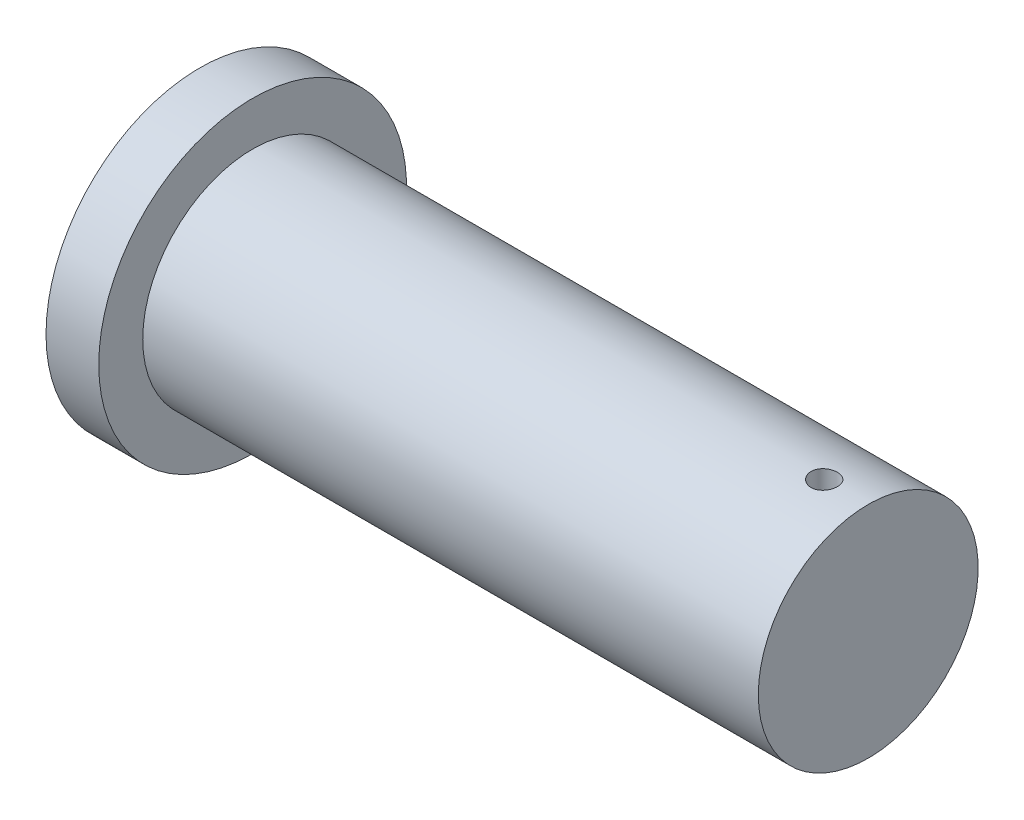
ISO-10303-21;
HEADER;
FILE_DESCRIPTION(('STEP AP214'),'2;1');
FILE_NAME('part.step','',(''),(''),'','','');
FILE_SCHEMA(('AUTOMOTIVE_DESIGN { 1 0 10303 214 1 1 1 1 }'));
ENDSEC;
DATA;
#1=APPLICATION_CONTEXT('core data for automotive mechanical design processes');
#2=APPLICATION_PROTOCOL_DEFINITION('international standard','automotive_design',2000,#1);
#3=PRODUCT_CONTEXT('',#1,'mechanical');
#4=PRODUCT('Part','Part','',(#3));
#5=PRODUCT_RELATED_PRODUCT_CATEGORY('part','',(#4));
#6=PRODUCT_DEFINITION_FORMATION('','',#4);
#7=PRODUCT_DEFINITION_CONTEXT('part definition',#1,'design');
#8=PRODUCT_DEFINITION('design','',#6,#7);
#9=PRODUCT_DEFINITION_SHAPE('','',#8);
#10=(LENGTH_UNIT() NAMED_UNIT(*) SI_UNIT(.MILLI.,.METRE.));
#11=(NAMED_UNIT(*) PLANE_ANGLE_UNIT() SI_UNIT($,.RADIAN.));
#12=(NAMED_UNIT(*) SI_UNIT($,.STERADIAN.) SOLID_ANGLE_UNIT());
#13=UNCERTAINTY_MEASURE_WITH_UNIT(LENGTH_MEASURE(1.E-05),#10,'distance_accuracy_value','');
#14=(GEOMETRIC_REPRESENTATION_CONTEXT(3) GLOBAL_UNCERTAINTY_ASSIGNED_CONTEXT((#13)) GLOBAL_UNIT_ASSIGNED_CONTEXT((#10,
#11,#12)) REPRESENTATION_CONTEXT('',''));
#15=CARTESIAN_POINT('',(0.,0.,0.));
#16=DIRECTION('',(0.,0.,1.));
#17=DIRECTION('',(1.,0.,0.));
#18=AXIS2_PLACEMENT_3D('',#15,#16,#17);
#19=CARTESIAN_POINT('',(0.,0.,0.));
#20=DIRECTION('',(-1.,0.,0.));
#21=DIRECTION('',(0.,0.,1.));
#22=AXIS2_PLACEMENT_3D('',#19,#20,#21);
#23=PLANE('',#22);
#24=CARTESIAN_POINT('',(0.,0.,0.));
#25=DIRECTION('',(-1.,0.,0.));
#26=DIRECTION('',(0.,0.,1.));
#27=AXIS2_PLACEMENT_3D('',#24,#25,#26);
#28=CIRCLE('',#27,250.);
#29=CARTESIAN_POINT('',(0.,0.,250.));
#30=VERTEX_POINT('',#29);
#31=EDGE_CURVE('E10',#30,#30,#28,.T.);
#32=ORIENTED_EDGE('',*,*,#31,.F.);
#33=EDGE_LOOP('',(#32));
#34=FACE_BOUND('',#33,.T.);
#35=ADVANCED_FACE('F33',(#34),#23,.F.);
#36=CARTESIAN_POINT('',(-1520.,0.,0.));
#37=DIRECTION('',(-1.,0.,0.));
#38=DIRECTION('',(0.,0.,1.));
#39=AXIS2_PLACEMENT_3D('',#36,#37,#38);
#40=CYLINDRICAL_SURFACE('',#39,250.);
#41=CARTESIAN_POINT('',(-99.9999999999999,-248.193472919817,30.));
#42=CARTESIAN_POINT('',(-99.1605704412996,-248.193474531631,29.9999946509676));
#43=CARTESIAN_POINT('',(-98.3209999755329,-248.197743080728,29.9647376822216));
#44=CARTESIAN_POINT('',(-96.6477411093539,-248.214699920192,29.8239438039664));
#45=CARTESIAN_POINT('',(-95.8140541037923,-248.2273901436,29.7183907592619));
#46=CARTESIAN_POINT('',(-94.1578034456569,-248.260840976248,29.437643248266));
#47=CARTESIAN_POINT('',(-93.3352513608933,-248.28160939787,29.2623813632194));
#48=CARTESIAN_POINT('',(-91.7080198209013,-248.330617331352,28.8435242149326));
#49=CARTESIAN_POINT('',(-90.903339348547,-248.358856416848,28.5999328513344));
#50=CARTESIAN_POINT('',(-89.317998086867,-248.421976036118,28.0463777739689));
#51=CARTESIAN_POINT('',(-88.5373220759401,-248.456852255905,27.7364571564889));
#52=CARTESIAN_POINT('',(-87.0049114314078,-248.532264669028,27.0523889546609));
#53=CARTESIAN_POINT('',(-86.253177185404,-248.572800938131,26.6782405105099));
#54=CARTESIAN_POINT('',(-84.7840383674126,-248.658375561636,25.8684731554346));
#55=CARTESIAN_POINT('',(-84.0666273066226,-248.703413060068,25.4328659252837));
#56=CARTESIAN_POINT('',(-82.6709543013999,-248.796726113069,24.5032084370154));
#57=CARTESIAN_POINT('',(-81.9926923788859,-248.845001669451,24.0091581461777));
#58=CARTESIAN_POINT('',(-80.6769699307077,-248.943662426129,22.9636627490856));
#59=CARTESIAN_POINT('',(-80.0397122376976,-248.994056337376,22.4119631888763));
#60=CARTESIAN_POINT('',(-78.813877743625,-249.095320238186,21.2569381320288));
#61=CARTESIAN_POINT('',(-78.2253011238872,-249.146190229521,20.6536124431131));
#62=CARTESIAN_POINT('',(-77.1009166074254,-249.24697467363,19.3995169953123));
#63=CARTESIAN_POINT('',(-76.5651112522726,-249.296889080287,18.7487449539387));
#64=CARTESIAN_POINT('',(-75.550068542811,-249.394354081313,17.404318456274));
#65=CARTESIAN_POINT('',(-75.0708312263755,-249.441904674099,16.7106639712729));
#66=CARTESIAN_POINT('',(-74.1709503684685,-249.533442144995,15.283136535881));
#67=CARTESIAN_POINT('',(-73.7504900499842,-249.577417708061,14.5491473403797));
#68=CARTESIAN_POINT('',(-72.9729317471988,-249.6603951477,13.0480665588376));
#69=CARTESIAN_POINT('',(-72.615833933811,-249.699397010857,12.2809748835135));
#70=CARTESIAN_POINT('',(-71.9676137333375,-249.771317118663,10.7191496279362));
#71=CARTESIAN_POINT('',(-71.6764895786895,-249.804235526295,9.92441678890155));
#72=CARTESIAN_POINT('',(-71.1623526454472,-249.863051734217,8.31296355266615));
#73=CARTESIAN_POINT('',(-70.9393395156996,-249.888949570703,7.49624326884759));
#74=CARTESIAN_POINT('',(-70.5639937924911,-249.932878697725,5.85066658367137));
#75=CARTESIAN_POINT('',(-70.4113249782118,-249.950947383566,5.02188786360798));
#76=CARTESIAN_POINT('',(-70.1762214803394,-249.978887329081,3.35429051231374));
#77=CARTESIAN_POINT('',(-70.093786593924,-249.988758612427,2.51547191008326));
#78=CARTESIAN_POINT('',(-69.999768971145,-250.000023346581,0.833843716312961));
#79=CARTESIAN_POINT('',(-69.9881839476418,-250.001417071057,-0.00896574551693431));
#80=CARTESIAN_POINT('',(-70.0359469725736,-249.995687792436,-1.69254185793255));
#81=CARTESIAN_POINT('',(-70.0952948260736,-249.988564812744,-2.53330851412588));
#82=CARTESIAN_POINT('',(-70.2839902365605,-249.966062777657,-4.20244453023439));
#83=CARTESIAN_POINT('',(-70.4129756019889,-249.950726444014,-5.03085544328968));
#84=CARTESIAN_POINT('',(-70.7397563510096,-249.9122557387,-6.67380360362003));
#85=CARTESIAN_POINT('',(-70.93755145992,-249.889121398159,-7.48834090626362));
#86=CARTESIAN_POINT('',(-71.4005057451194,-249.83570252719,-9.0978085296885));
#87=CARTESIAN_POINT('',(-71.6656657510936,-249.805417908697,-9.89273860884938));
#88=CARTESIAN_POINT('',(-72.2614256369836,-249.738545201862,-11.4574117372028));
#89=CARTESIAN_POINT('',(-72.59202576275,-249.701957089838,-12.2271546917578));
#90=CARTESIAN_POINT('',(-73.3171950719122,-249.623400157603,-13.7379683316623));
#91=CARTESIAN_POINT('',(-73.7119212719414,-249.581418184343,-14.4789629635211));
#92=CARTESIAN_POINT('',(-74.5619419825065,-249.493318926867,-15.9250956040533));
#93=CARTESIAN_POINT('',(-75.0172365566416,-249.447201638309,-16.6302335750746));
#94=CARTESIAN_POINT('',(-75.9852011329583,-249.352117841448,-17.9997951231493));
#95=CARTESIAN_POINT('',(-76.4978731815444,-249.303151231553,-18.664217246737));
#96=CARTESIAN_POINT('',(-77.5769982761518,-249.203736816779,-19.9477312714739));
#97=CARTESIAN_POINT('',(-78.1434515603623,-249.153289005341,-20.5668229718397));
#98=CARTESIAN_POINT('',(-79.3299406645818,-249.052002372002,-21.7591461132143));
#99=CARTESIAN_POINT('',(-79.9502918580205,-249.001163090519,-22.3320637323764));
#100=CARTESIAN_POINT('',(-81.2371340127194,-248.900851276313,-23.4236363437972));
#101=CARTESIAN_POINT('',(-81.9036251798656,-248.851378749691,-23.9422910938981));
#102=CARTESIAN_POINT('',(-83.2780876706927,-248.755205933452,-24.9216719052182));
#103=CARTESIAN_POINT('',(-83.9860592130022,-248.708505658448,-25.3823976610738));
#104=CARTESIAN_POINT('',(-85.438514856123,-248.619209908325,-26.2426285291918));
#105=CARTESIAN_POINT('',(-86.1829988919794,-248.576614425904,-26.6421337503589));
#106=CARTESIAN_POINT('',(-87.7035273081534,-248.496733797357,-27.3771821116765));
#107=CARTESIAN_POINT('',(-88.4795835569099,-248.459450672381,-27.712700923772));
#108=CARTESIAN_POINT('',(-90.0574899940134,-248.391288696872,-28.3171374504508));
#109=CARTESIAN_POINT('',(-90.859340207393,-248.360409852555,-28.5860551003969));
#110=CARTESIAN_POINT('',(-92.4830802912907,-248.305951958708,-29.0552932977666));
#111=CARTESIAN_POINT('',(-93.3049694341118,-248.282372644526,-29.255616332184));
#112=CARTESIAN_POINT('',(-94.9629086586694,-248.243198383256,-29.5861827187821));
#113=CARTESIAN_POINT('',(-95.7989586627771,-248.227603392413,-29.716426455005));
#114=CARTESIAN_POINT('',(-97.4739530162567,-248.204923432622,-29.9052668310815));
#115=CARTESIAN_POINT('',(-98.3128469910561,-248.197786118229,-29.9643042155057));
#116=CARTESIAN_POINT('',(-99.9926576197042,-248.192051927075,-30.0117633896308));
#117=CARTESIAN_POINT('',(-100.833574265199,-248.193455015103,-30.0001854704649));
#118=CARTESIAN_POINT('',(-102.511395065306,-248.204760956533,-29.9065018038126));
#119=CARTESIAN_POINT('',(-103.348299294855,-248.214663650566,-29.8243973787052));
#120=CARTESIAN_POINT('',(-105.012129982595,-248.242682732508,-29.5902743976899));
#121=CARTESIAN_POINT('',(-105.839056445803,-248.260799116285,-29.4382558769449));
#122=CARTESIAN_POINT('',(-107.474502965533,-248.304655640846,-29.0660101429271));
#123=CARTESIAN_POINT('',(-108.283072119113,-248.330371983227,-28.8459957539828));
#124=CARTESIAN_POINT('',(-109.878751686147,-248.388715473606,-28.3392134881515));
#125=CARTESIAN_POINT('',(-110.665862159057,-248.421342602454,-28.0524457962345));
#126=CARTESIAN_POINT('',(-112.213143298546,-248.492582429562,-27.4142208538501));
#127=CARTESIAN_POINT('',(-112.973313286559,-248.531195278457,-27.062761975343));
#128=CARTESIAN_POINT('',(-114.461416251638,-248.613315286474,-26.2976691995083));
#129=CARTESIAN_POINT('',(-115.189349066541,-248.656822470213,-25.8840349894648));
#130=CARTESIAN_POINT('',(-116.611408771141,-248.747729364898,-24.9953500062538));
#131=CARTESIAN_POINT('',(-117.305353560671,-248.795147017641,-24.5200096625206));
#132=CARTESIAN_POINT('',(-118.650792269958,-248.892349734088,-23.5128496840407));
#133=CARTESIAN_POINT('',(-119.302286068319,-248.94213480456,-22.9810298877921));
#134=CARTESIAN_POINT('',(-120.558322824152,-249.042672336284,-21.8646149255231));
#135=CARTESIAN_POINT('',(-121.162864296291,-249.093424828075,-21.2800180911685));
#136=CARTESIAN_POINT('',(-122.320773332465,-249.194470611332,-20.0621306020361));
#137=CARTESIAN_POINT('',(-122.874140753962,-249.244763901518,-19.4288398116353));
#138=CARTESIAN_POINT('',(-123.928599123128,-249.343740229315,-18.1145159166704));
#139=CARTESIAN_POINT('',(-124.42940051076,-249.392413432178,-17.433249721657));
#140=CARTESIAN_POINT('',(-125.371826218617,-249.486491898318,-16.0307281687417));
#141=CARTESIAN_POINT('',(-125.813450300064,-249.531897148409,-15.3094726495014));
#142=CARTESIAN_POINT('',(-126.634344274995,-249.618151591168,-13.8320586111139));
#143=CARTESIAN_POINT('',(-127.013614990501,-249.659000843896,-13.0759005522647));
#144=CARTESIAN_POINT('',(-127.707054443502,-249.734983564515,-11.5340229887521));
#145=CARTESIAN_POINT('',(-128.021223433973,-249.770117054615,-10.7483035989736));
#146=CARTESIAN_POINT('',(-128.581451853234,-249.833588745784,-9.15489098903913));
#147=CARTESIAN_POINT('',(-128.827679671532,-249.861943723365,-8.34725764502252));
#148=CARTESIAN_POINT('',(-129.251245916454,-249.911166395072,-6.71389777364351));
#149=CARTESIAN_POINT('',(-129.428584416741,-249.932034097204,-5.88817126562872));
#150=CARTESIAN_POINT('',(-129.713045056139,-249.965687778844,-4.22457629840829));
#151=CARTESIAN_POINT('',(-129.820169630991,-249.9784740387,-3.38670826142655));
#152=CARTESIAN_POINT('',(-129.963407887769,-249.99560143016,-1.70483954433613));
#153=CARTESIAN_POINT('',(-129.999521891187,-249.999942599999,-0.860838892009497));
#154=CARTESIAN_POINT('',(-130.000465701341,-250.000055910935,0.821891060714172));
#155=CARTESIAN_POINT('',(-129.965742246484,-249.995881754181,1.66062014165991));
#156=CARTESIAN_POINT('',(-129.826166823084,-249.979190014585,3.33213559205111));
#157=CARTESIAN_POINT('',(-129.721315169327,-249.966672469195,4.16492198815466));
#158=CARTESIAN_POINT('',(-129.442260953022,-249.933646334168,5.81862750164889));
#159=CARTESIAN_POINT('',(-129.268058587308,-249.913137767213,6.63954665271504));
#160=CARTESIAN_POINT('',(-128.85158524623,-249.86470587868,8.26370804760726));
#161=CARTESIAN_POINT('',(-128.609314148308,-249.836782543753,9.06695025960342));
#162=CARTESIAN_POINT('',(-128.058554843598,-249.774313586065,10.6498604352754));
#163=CARTESIAN_POINT('',(-127.750086724312,-249.739769972569,11.4295354687165));
#164=CARTESIAN_POINT('',(-127.069115802717,-249.665020719012,12.9601146784351));
#165=CARTESIAN_POINT('',(-126.696613049426,-249.624815083284,13.7110188767354));
#166=CARTESIAN_POINT('',(-125.890228843372,-249.539863095647,15.1788419699796));
#167=CARTESIAN_POINT('',(-125.45634734603,-249.495116740438,15.8957608402394));
#168=CARTESIAN_POINT('',(-124.530265194195,-249.402329067066,17.2906605810803));
#169=CARTESIAN_POINT('',(-124.038064289256,-249.354287734752,17.9686412844272));
#170=CARTESIAN_POINT('',(-122.995639159189,-249.255950077794,19.2849594194556));
#171=CARTESIAN_POINT('',(-122.445082438353,-249.205641885906,19.9230326801021));
#172=CARTESIAN_POINT('',(-121.292280176235,-249.104459244391,21.1505976868386));
#173=CARTESIAN_POINT('',(-120.690034250122,-249.053584790551,21.7400890711682));
#174=CARTESIAN_POINT('',(-119.437907579956,-248.952691992913,22.8665055592456));
#175=CARTESIAN_POINT('',(-118.788015340803,-248.902673859324,23.4034179043673));
#176=CARTESIAN_POINT('',(-117.445263889129,-248.804921545612,24.4207336954875));
#177=CARTESIAN_POINT('',(-116.752405246466,-248.757187335214,24.9011378907016));
#178=CARTESIAN_POINT('',(-115.326017000732,-248.665193713503,25.8036432950789));
#179=CARTESIAN_POINT('',(-114.592351663176,-248.620947248293,26.2255313287722));
#180=CARTESIAN_POINT('',(-113.091732249697,-248.537386184943,27.0059583921024));
#181=CARTESIAN_POINT('',(-112.324776130025,-248.498071890171,27.3644935255784));
#182=CARTESIAN_POINT('',(-110.763871473165,-248.425549653007,28.0152351882781));
#183=CARTESIAN_POINT('',(-109.969950899548,-248.392335600441,28.3075081571224));
#184=CARTESIAN_POINT('',(-108.36013899519,-248.332932727422,28.8239875750066));
#185=CARTESIAN_POINT('',(-107.544252946941,-248.306742234185,29.0482102331036));
#186=CARTESIAN_POINT('',(-106.169993277539,-248.269542249127,29.3640997551931));
#187=CARTESIAN_POINT('',(-105.616030955531,-248.256379293141,29.4750618477914));
#188=CARTESIAN_POINT('',(-104.502667838974,-248.233689152617,29.6655497040171));
#189=CARTESIAN_POINT('',(-103.943267497728,-248.224161667652,29.7450780652627));
#190=CARTESIAN_POINT('',(-102.82076790437,-248.208867224382,29.8724346728726));
#191=CARTESIAN_POINT('',(-102.257668326193,-248.203100602191,29.9202600859007));
#192=CARTESIAN_POINT('',(-101.129733640301,-248.195403114445,29.9840428305316));
#193=CARTESIAN_POINT('',(-100.564898726378,-248.193471835138,30.0000035996607));
#194=CARTESIAN_POINT('',(-99.9999999999999,-248.193472919817,30.));
#195=B_SPLINE_CURVE_WITH_KNOTS('',3,(#41,#42,#43,#44,#45,#46,#47,#48,#49,#50,#51,#52,#53,#54,
#55,#56,#57,#58,#59,#60,#61,#62,#63,#64,#65,#66,#67,#68,#69,#70,#71,#72,#73,#74,#75,#76,#77,#78,
#79,#80,#81,#82,#83,#84,#85,#86,#87,#88,#89,#90,#91,#92,#93,#94,#95,#96,#97,#98,#99,#100,#101,
#102,#103,#104,#105,#106,#107,#108,#109,#110,#111,#112,#113,#114,#115,#116,#117,#118,#119,#120,
#121,#122,#123,#124,#125,#126,#127,#128,#129,#130,#131,#132,#133,#134,#135,#136,#137,#138,#139,
#140,#141,#142,#143,#144,#145,#146,#147,#148,#149,#150,#151,#152,#153,#154,#155,#156,#157,#158,
#159,#160,#161,#162,#163,#164,#165,#166,#167,#168,#169,#170,#171,#172,#173,#174,#175,#176,#177,
#178,#179,#180,#181,#182,#183,#184,#185,#186,#187,#188,#189,#190,#191,#192,#193,#194),
.UNSPECIFIED.,.T.,.F.,(4,2,2,2,2,2,2,2,2,2,2,2,2,2,2,2,2,2,2,2,2,2,2,2,2,2,2,2,2,2,2,2,2,2,2,2,
2,2,2,2,2,2,2,2,2,2,2,2,2,2,2,2,2,2,2,2,2,2,2,2,2,2,2,2,2,2,2,2,2,2,2,2,2,2,2,2,4),(0.,
2.51778336120793,5.03614483340467,7.55694787915785,10.0776070890421,12.596633489329,
15.1156936138648,17.6342756125914,20.1528590213977,22.683070425122,25.2132912528273,
27.7436338815808,30.2739782044392,32.8120422932015,35.3501132279974,37.8881161549024,
40.4261059966501,42.9518359963829,45.4775587022602,48.0031998736002,50.5288341040818,
53.0414570607045,55.5540699872897,58.0667138614277,60.5793671754448,63.0982682651093,
65.6171719997426,68.1361656013438,70.6551703597176,73.190060359931,75.7249616720726,
78.2598763459938,80.7947865105238,83.3306585515195,85.8665330536024,88.4023156042651,
90.9380842584262,93.4580754143531,95.9780561808548,98.4979896984997,101.017921948763,
103.530045452468,106.042161995284,108.554341767491,111.06653417533,113.590973306469,
116.115419656387,118.639945834501,121.164479044206,123.702259810315,126.240050815944,
128.777808362505,131.315556047529,133.846956344173,136.378353934039,138.909663704341,
141.440962014409,143.956345976335,146.471718647479,148.987084179392,151.502454240218,
154.017062088028,156.531668010964,159.046275760263,161.560894308643,164.090700724772,
166.620525977165,169.150963593885,171.681367656906,174.220760623166,176.760309706082,
179.297301064822,181.833687656739,183.528215248704,185.222602779138,186.91714171891,
188.611497843615),.UNSPECIFIED.);
#196=CARTESIAN_POINT('',(-99.9999999999999,-248.193472919817,30.));
#197=VERTEX_POINT('',#196);
#198=EDGE_CURVE('E36',#197,#197,#195,.T.);
#199=ORIENTED_EDGE('',*,*,#198,.T.);
#200=EDGE_LOOP('',(#199));
#201=FACE_BOUND('',#200,.T.);
#202=CARTESIAN_POINT('',(-99.9999999999999,248.193472919817,30.));
#203=CARTESIAN_POINT('',(-100.8394295587,248.193474531631,29.9999946509676));
#204=CARTESIAN_POINT('',(-101.679000024467,248.197743080728,29.9647376822216));
#205=CARTESIAN_POINT('',(-103.352258890646,248.214699920192,29.8239438039664));
#206=CARTESIAN_POINT('',(-104.185945896207,248.2273901436,29.7183907592619));
#207=CARTESIAN_POINT('',(-105.842196554343,248.260840976248,29.437643248266));
#208=CARTESIAN_POINT('',(-106.664748639106,248.28160939787,29.2623813632194));
#209=CARTESIAN_POINT('',(-108.291980179098,248.330617331352,28.8435242149326));
#210=CARTESIAN_POINT('',(-109.096660651453,248.358856416848,28.5999328513344));
#211=CARTESIAN_POINT('',(-110.682001913133,248.421976036118,28.0463777739689));
#212=CARTESIAN_POINT('',(-111.46267792406,248.456852255905,27.7364571564889));
#213=CARTESIAN_POINT('',(-112.995088568592,248.532264669028,27.0523889546609));
#214=CARTESIAN_POINT('',(-113.746822814596,248.572800938131,26.6782405105099));
#215=CARTESIAN_POINT('',(-115.215961632587,248.658375561636,25.8684731554346));
#216=CARTESIAN_POINT('',(-115.933372693377,248.703413060068,25.4328659252837));
#217=CARTESIAN_POINT('',(-117.3290456986,248.796726113069,24.5032084370154));
#218=CARTESIAN_POINT('',(-118.007307621114,248.845001669451,24.0091581461777));
#219=CARTESIAN_POINT('',(-119.323030069292,248.943662426129,22.9636627490856));
#220=CARTESIAN_POINT('',(-119.960287762302,248.994056337376,22.4119631888763));
#221=CARTESIAN_POINT('',(-121.186122256375,249.095320238186,21.2569381320288));
#222=CARTESIAN_POINT('',(-121.774698876113,249.146190229521,20.6536124431131));
#223=CARTESIAN_POINT('',(-122.899083392574,249.24697467363,19.3995169953123));
#224=CARTESIAN_POINT('',(-123.434888747727,249.296889080287,18.7487449539387));
#225=CARTESIAN_POINT('',(-124.449931457189,249.394354081313,17.404318456274));
#226=CARTESIAN_POINT('',(-124.929168773624,249.441904674099,16.7106639712729));
#227=CARTESIAN_POINT('',(-125.829049631531,249.533442144995,15.283136535881));
#228=CARTESIAN_POINT('',(-126.249509950016,249.577417708061,14.5491473403797));
#229=CARTESIAN_POINT('',(-127.027068252801,249.6603951477,13.0480665588375));
#230=CARTESIAN_POINT('',(-127.384166066189,249.699397010857,12.2809748835135));
#231=CARTESIAN_POINT('',(-128.032386266662,249.771317118663,10.7191496279362));
#232=CARTESIAN_POINT('',(-128.32351042131,249.804235526295,9.92441678890155));
#233=CARTESIAN_POINT('',(-128.837647354553,249.863051734217,8.31296355266615));
#234=CARTESIAN_POINT('',(-129.0606604843,249.888949570703,7.49624326884759));
#235=CARTESIAN_POINT('',(-129.436006207509,249.932878697725,5.85066658367137));
#236=CARTESIAN_POINT('',(-129.588675021788,249.950947383566,5.02188786360798));
#237=CARTESIAN_POINT('',(-129.82377851966,249.978887329081,3.35429051231374));
#238=CARTESIAN_POINT('',(-129.906213406076,249.988758612427,2.51547191008326));
#239=CARTESIAN_POINT('',(-130.000231028855,250.000023346581,0.833843716312968));
#240=CARTESIAN_POINT('',(-130.011816052358,250.001417071057,-0.00896574551692705));
#241=CARTESIAN_POINT('',(-129.964053027426,249.995687792436,-1.69254185793255));
#242=CARTESIAN_POINT('',(-129.904705173926,249.988564812744,-2.53330851412587));
#243=CARTESIAN_POINT('',(-129.716009763439,249.966062777657,-4.20244453023438));
#244=CARTESIAN_POINT('',(-129.587024398011,249.950726444014,-5.03085544328968));
#245=CARTESIAN_POINT('',(-129.26024364899,249.9122557387,-6.67380360362003));
#246=CARTESIAN_POINT('',(-129.06244854008,249.889121398159,-7.48834090626361));
#247=CARTESIAN_POINT('',(-128.59949425488,249.83570252719,-9.09780852968848));
#248=CARTESIAN_POINT('',(-128.334334248906,249.805417908697,-9.89273860884936));
#249=CARTESIAN_POINT('',(-127.738574363016,249.738545201862,-11.4574117372028));
#250=CARTESIAN_POINT('',(-127.40797423725,249.701957089838,-12.2271546917578));
#251=CARTESIAN_POINT('',(-126.682804928088,249.623400157603,-13.7379683316623));
#252=CARTESIAN_POINT('',(-126.288078728058,249.581418184343,-14.4789629635211));
#253=CARTESIAN_POINT('',(-125.438058017493,249.493318926867,-15.9250956040533));
#254=CARTESIAN_POINT('',(-124.982763443358,249.447201638309,-16.6302335750746));
#255=CARTESIAN_POINT('',(-124.014798867041,249.352117841448,-17.9997951231493));
#256=CARTESIAN_POINT('',(-123.502126818455,249.303151231553,-18.664217246737));
#257=CARTESIAN_POINT('',(-122.423001723848,249.203736816779,-19.9477312714739));
#258=CARTESIAN_POINT('',(-121.856548439637,249.153289005341,-20.5668229718397));
#259=CARTESIAN_POINT('',(-120.670059335418,249.052002372002,-21.7591461132143));
#260=CARTESIAN_POINT('',(-120.049708141979,249.001163090519,-22.3320637323764));
#261=CARTESIAN_POINT('',(-118.76286598728,248.900851276313,-23.4236363437972));
#262=CARTESIAN_POINT('',(-118.096374820134,248.851378749691,-23.9422910938981));
#263=CARTESIAN_POINT('',(-116.721912329307,248.755205933452,-24.9216719052182));
#264=CARTESIAN_POINT('',(-116.013940786998,248.708505658448,-25.3823976610738));
#265=CARTESIAN_POINT('',(-114.561485143877,248.619209908325,-26.2426285291918));
#266=CARTESIAN_POINT('',(-113.81700110802,248.576614425904,-26.6421337503589));
#267=CARTESIAN_POINT('',(-112.296472691846,248.496733797357,-27.3771821116765));
#268=CARTESIAN_POINT('',(-111.52041644309,248.459450672381,-27.712700923772));
#269=CARTESIAN_POINT('',(-109.942510005986,248.391288696872,-28.3171374504508));
#270=CARTESIAN_POINT('',(-109.140659792607,248.360409852555,-28.5860551003969));
#271=CARTESIAN_POINT('',(-107.516919708709,248.305951958708,-29.0552932977666));
#272=CARTESIAN_POINT('',(-106.695030565888,248.282372644526,-29.255616332184));
#273=CARTESIAN_POINT('',(-105.03709134133,248.243198383256,-29.5861827187821));
#274=CARTESIAN_POINT('',(-104.201041337223,248.227603392413,-29.716426455005));
#275=CARTESIAN_POINT('',(-102.526046983743,248.204923432622,-29.9052668310815));
#276=CARTESIAN_POINT('',(-101.687153008944,248.197786118229,-29.9643042155057));
#277=CARTESIAN_POINT('',(-100.007342380296,248.192051927075,-30.0117633896308));
#278=CARTESIAN_POINT('',(-99.1664257348003,248.193455015103,-30.0001854704649));
#279=CARTESIAN_POINT('',(-97.4886049346936,248.204760956533,-29.9065018038126));
#280=CARTESIAN_POINT('',(-96.6517007051447,248.214663650566,-29.8243973787052));
#281=CARTESIAN_POINT('',(-94.9878700174052,248.242682732508,-29.5902743976899));
#282=CARTESIAN_POINT('',(-94.1609435541965,248.260799116285,-29.4382558769449));
#283=CARTESIAN_POINT('',(-92.5254970344665,248.304655640846,-29.0660101429271));
#284=CARTESIAN_POINT('',(-91.7169278808872,248.330371983227,-28.8459957539828));
#285=CARTESIAN_POINT('',(-90.1212483138525,248.388715473606,-28.3392134881515));
#286=CARTESIAN_POINT('',(-89.334137840943,248.421342602454,-28.0524457962345));
#287=CARTESIAN_POINT('',(-87.7868567014533,248.492582429562,-27.4142208538501));
#288=CARTESIAN_POINT('',(-87.0266867134405,248.531195278457,-27.062761975343));
#289=CARTESIAN_POINT('',(-85.5385837483617,248.613315286474,-26.2976691995083));
#290=CARTESIAN_POINT('',(-84.810650933459,248.656822470213,-25.8840349894648));
#291=CARTESIAN_POINT('',(-83.3885912288584,248.747729364898,-24.9953500062538));
#292=CARTESIAN_POINT('',(-82.6946464393286,248.795147017641,-24.5200096625206));
#293=CARTESIAN_POINT('',(-81.3492077300415,248.892349734088,-23.5128496840407));
#294=CARTESIAN_POINT('',(-80.6977139316805,248.94213480456,-22.9810298877921));
#295=CARTESIAN_POINT('',(-79.4416771758474,249.042672336284,-21.8646149255231));
#296=CARTESIAN_POINT('',(-78.8371357037092,249.093424828075,-21.2800180911685));
#297=CARTESIAN_POINT('',(-77.6792266675343,249.194470611332,-20.062130602036));
#298=CARTESIAN_POINT('',(-77.1258592460375,249.244763901518,-19.4288398116353));
#299=CARTESIAN_POINT('',(-76.0714008768716,249.343740229315,-18.1145159166704));
#300=CARTESIAN_POINT('',(-75.5705994892393,249.392413432178,-17.433249721657));
#301=CARTESIAN_POINT('',(-74.6281737813824,249.486491898318,-16.0307281687417));
#302=CARTESIAN_POINT('',(-74.1865496999355,249.531897148409,-15.3094726495014));
#303=CARTESIAN_POINT('',(-73.3656557250045,249.618151591168,-13.8320586111139));
#304=CARTESIAN_POINT('',(-72.9863850094992,249.659000843896,-13.0759005522647));
#305=CARTESIAN_POINT('',(-72.2929455564981,249.734983564515,-11.5340229887521));
#306=CARTESIAN_POINT('',(-71.9787765660265,249.770117054615,-10.7483035989736));
#307=CARTESIAN_POINT('',(-71.418548146766,249.833588745784,-9.15489098903914));
#308=CARTESIAN_POINT('',(-71.1723203284682,249.861943723365,-8.34725764502252));
#309=CARTESIAN_POINT('',(-70.7487540835456,249.911166395072,-6.7138977736435));
#310=CARTESIAN_POINT('',(-70.571415583259,249.932034097204,-5.88817126562872));
#311=CARTESIAN_POINT('',(-70.2869549438611,249.965687778844,-4.22457629840829));
#312=CARTESIAN_POINT('',(-70.1798303690084,249.9784740387,-3.38670826142655));
#313=CARTESIAN_POINT('',(-70.0365921122303,249.99560143016,-1.70483954433613));
#314=CARTESIAN_POINT('',(-70.0004781088129,249.999942599999,-0.860838892009503));
#315=CARTESIAN_POINT('',(-69.9995342986588,250.000055910935,0.82189106071417));
#316=CARTESIAN_POINT('',(-70.0342577535158,249.995881754181,1.66062014165992));
#317=CARTESIAN_POINT('',(-70.1738331769155,249.979190014585,3.33213559205111));
#318=CARTESIAN_POINT('',(-70.2786848306724,249.966672469195,4.16492198815466));
#319=CARTESIAN_POINT('',(-70.557739046978,249.933646334168,5.81862750164888));
#320=CARTESIAN_POINT('',(-70.7319414126914,249.913137767213,6.63954665271504));
#321=CARTESIAN_POINT('',(-71.1484147537701,249.86470587868,8.26370804760726));
#322=CARTESIAN_POINT('',(-71.3906858516922,249.836782543753,9.06695025960341));
#323=CARTESIAN_POINT('',(-71.9414451564014,249.774313586065,10.6498604352754));
#324=CARTESIAN_POINT('',(-72.2499132756873,249.739769972569,11.4295354687165));
#325=CARTESIAN_POINT('',(-72.9308841972822,249.665020719012,12.960114678435));
#326=CARTESIAN_POINT('',(-73.303386950574,249.624815083284,13.7110188767354));
#327=CARTESIAN_POINT('',(-74.109771156628,249.539863095647,15.1788419699796));
#328=CARTESIAN_POINT('',(-74.5436526539694,249.495116740438,15.8957608402394));
#329=CARTESIAN_POINT('',(-75.4697348058046,249.402329067066,17.2906605810802));
#330=CARTESIAN_POINT('',(-75.9619357107441,249.354287734752,17.9686412844272));
#331=CARTESIAN_POINT('',(-77.0043608408111,249.255950077794,19.2849594194556));
#332=CARTESIAN_POINT('',(-77.5549175616463,249.205641885906,19.9230326801021));
#333=CARTESIAN_POINT('',(-78.7077198237644,249.104459244391,21.1505976868386));
#334=CARTESIAN_POINT('',(-79.3099657498778,249.053584790551,21.7400890711682));
#335=CARTESIAN_POINT('',(-80.5620924200439,248.952691992913,22.8665055592456));
#336=CARTESIAN_POINT('',(-81.2119846591963,248.902673859324,23.4034179043673));
#337=CARTESIAN_POINT('',(-82.5547361108704,248.804921545612,24.4207336954875));
#338=CARTESIAN_POINT('',(-83.2475947535341,248.757187335214,24.9011378907016));
#339=CARTESIAN_POINT('',(-84.6739829992673,248.665193713503,25.803643295079));
#340=CARTESIAN_POINT('',(-85.4076483368238,248.620947248293,26.2255313287722));
#341=CARTESIAN_POINT('',(-86.9082677503022,248.537386184943,27.0059583921024));
#342=CARTESIAN_POINT('',(-87.6752238699745,248.498071890171,27.3644935255784));
#343=CARTESIAN_POINT('',(-89.2361285268345,248.425549653007,28.0152351882781));
#344=CARTESIAN_POINT('',(-90.0300491004515,248.392335600441,28.3075081571224));
#345=CARTESIAN_POINT('',(-91.6398610048102,248.332932727422,28.8239875750066));
#346=CARTESIAN_POINT('',(-92.4557470530586,248.306742234185,29.0482102331036));
#347=CARTESIAN_POINT('',(-93.8300067224604,248.269542249127,29.3640997551931));
#348=CARTESIAN_POINT('',(-94.3839690444689,248.256379293141,29.4750618477914));
#349=CARTESIAN_POINT('',(-95.4973321610261,248.233689152617,29.6655497040171));
#350=CARTESIAN_POINT('',(-96.0567325022721,248.224161667652,29.7450780652627));
#351=CARTESIAN_POINT('',(-97.1792320956296,248.208867224382,29.8724346728726));
#352=CARTESIAN_POINT('',(-97.7423316738064,248.203100602191,29.9202600859007));
#353=CARTESIAN_POINT('',(-98.8702663596982,248.195403114445,29.9840428305316));
#354=CARTESIAN_POINT('',(-99.4351012736219,248.193471835138,30.0000035996607));
#355=CARTESIAN_POINT('',(-99.9999999999999,248.193472919817,30.));
#356=B_SPLINE_CURVE_WITH_KNOTS('',3,(#202,#203,#204,#205,#206,#207,#208,#209,#210,#211,#212,
#213,#214,#215,#216,#217,#218,#219,#220,#221,#222,#223,#224,#225,#226,#227,#228,#229,#230,#231,
#232,#233,#234,#235,#236,#237,#238,#239,#240,#241,#242,#243,#244,#245,#246,#247,#248,#249,#250,
#251,#252,#253,#254,#255,#256,#257,#258,#259,#260,#261,#262,#263,#264,#265,#266,#267,#268,#269,
#270,#271,#272,#273,#274,#275,#276,#277,#278,#279,#280,#281,#282,#283,#284,#285,#286,#287,#288,
#289,#290,#291,#292,#293,#294,#295,#296,#297,#298,#299,#300,#301,#302,#303,#304,#305,#306,#307,
#308,#309,#310,#311,#312,#313,#314,#315,#316,#317,#318,#319,#320,#321,#322,#323,#324,#325,#326,
#327,#328,#329,#330,#331,#332,#333,#334,#335,#336,#337,#338,#339,#340,#341,#342,#343,#344,#345,
#346,#347,#348,#349,#350,#351,#352,#353,#354,#355),.UNSPECIFIED.,.T.,.F.,(4,2,2,2,2,2,2,2,2,2,2,
2,2,2,2,2,2,2,2,2,2,2,2,2,2,2,2,2,2,2,2,2,2,2,2,2,2,2,2,2,2,2,2,2,2,2,2,2,2,2,2,2,2,2,2,2,2,2,2,
2,2,2,2,2,2,2,2,2,2,2,2,2,2,2,2,2,4),(0.,2.51778336120793,5.03614483340467,7.55694787915783,
10.0776070890421,12.596633489329,15.1156936138648,17.6342756125914,20.1528590213977,
22.683070425122,25.2132912528273,27.7436338815808,30.2739782044392,32.8120422932015,
35.3501132279974,37.8881161549024,40.4261059966501,42.9518359963829,45.4775587022602,
48.0031998736002,50.5288341040818,53.0414570607045,55.5540699872897,58.0667138614277,
60.5793671754447,63.0982682651093,65.6171719997426,68.1361656013437,70.6551703597175,
73.190060359931,75.7249616720726,78.2598763459937,80.7947865105238,83.3306585515195,
85.8665330536023,88.4023156042651,90.9380842584262,93.4580754143531,95.9780561808548,
98.4979896984997,101.017921948763,103.530045452468,106.042161995284,108.554341767491,
111.06653417533,113.590973306469,116.115419656387,118.639945834501,121.164479044206,
123.702259810315,126.240050815944,128.777808362505,131.315556047529,133.846956344173,
136.378353934039,138.909663704341,141.440962014409,143.956345976335,146.471718647479,
148.987084179392,151.502454240218,154.017062088027,156.531668010964,159.046275760263,
161.560894308643,164.090700724772,166.620525977165,169.150963593885,171.681367656906,
174.220760623166,176.760309706082,179.297301064822,181.833687656739,183.528215248704,
185.222602779138,186.91714171891,188.611497843615),.UNSPECIFIED.);
#357=CARTESIAN_POINT('',(-99.9999999999999,248.193472919817,30.));
#358=VERTEX_POINT('',#357);
#359=EDGE_CURVE('E52',#358,#358,#356,.T.);
#360=ORIENTED_EDGE('',*,*,#359,.T.);
#361=EDGE_LOOP('',(#360));
#362=FACE_BOUND('',#361,.T.);
#363=CARTESIAN_POINT('',(-1400.,0.,0.));
#364=DIRECTION('',(-1.,0.,0.));
#365=DIRECTION('',(0.,0.,1.));
#366=AXIS2_PLACEMENT_3D('',#363,#364,#365);
#367=CIRCLE('',#366,250.);
#368=CARTESIAN_POINT('',(-1400.,0.,250.));
#369=VERTEX_POINT('',#368);
#370=EDGE_CURVE('E44',#369,#369,#367,.T.);
#371=ORIENTED_EDGE('',*,*,#370,.F.);
#372=EDGE_LOOP('',(#371));
#373=FACE_BOUND('',#372,.T.);
#374=ORIENTED_EDGE('',*,*,#31,.T.);
#375=EDGE_LOOP('',(#374));
#376=FACE_BOUND('',#375,.T.);
#377=ADVANCED_FACE('F57',(#201,#362,#373,#376),#40,.T.);
#378=CARTESIAN_POINT('',(-1400.,250.,0.));
#379=DIRECTION('',(-1.,0.,0.));
#380=DIRECTION('',(0.,0.,1.));
#381=AXIS2_PLACEMENT_3D('',#378,#379,#380);
#382=PLANE('',#381);
#383=CARTESIAN_POINT('',(-1400.,0.,0.));
#384=DIRECTION('',(-1.,0.,0.));
#385=DIRECTION('',(0.,0.,1.));
#386=AXIS2_PLACEMENT_3D('',#383,#384,#385);
#387=CIRCLE('',#386,350.);
#388=CARTESIAN_POINT('',(-1400.,0.,350.));
#389=VERTEX_POINT('',#388);
#390=EDGE_CURVE('E49',#389,#389,#387,.T.);
#391=ORIENTED_EDGE('',*,*,#390,.F.);
#392=EDGE_LOOP('',(#391));
#393=FACE_BOUND('',#392,.T.);
#394=ORIENTED_EDGE('',*,*,#370,.T.);
#395=EDGE_LOOP('',(#394));
#396=FACE_BOUND('',#395,.T.);
#397=ADVANCED_FACE('F72',(#393,#396),#382,.F.);
#398=CARTESIAN_POINT('',(-1520.,0.,0.));
#399=DIRECTION('',(-1.,0.,0.));
#400=DIRECTION('',(0.,0.,1.));
#401=AXIS2_PLACEMENT_3D('',#398,#399,#400);
#402=CYLINDRICAL_SURFACE('',#401,350.);
#403=CARTESIAN_POINT('',(-1520.,0.,0.));
#404=DIRECTION('',(-1.,0.,0.));
#405=DIRECTION('',(0.,0.,1.));
#406=AXIS2_PLACEMENT_3D('',#403,#404,#405);
#407=CIRCLE('',#406,350.);
#408=CARTESIAN_POINT('',(-1520.,0.,350.));
#409=VERTEX_POINT('',#408);
#410=EDGE_CURVE('E122',#409,#409,#407,.T.);
#411=ORIENTED_EDGE('',*,*,#410,.F.);
#412=EDGE_LOOP('',(#411));
#413=FACE_BOUND('',#412,.T.);
#414=ORIENTED_EDGE('',*,*,#390,.T.);
#415=EDGE_LOOP('',(#414));
#416=FACE_BOUND('',#415,.T.);
#417=ADVANCED_FACE('F69',(#413,#416),#402,.T.);
#418=CARTESIAN_POINT('',(-1520.,350.,0.));
#419=DIRECTION('',(1.,0.,0.));
#420=DIRECTION('',(0.,0.,-1.));
#421=AXIS2_PLACEMENT_3D('',#418,#419,#420);
#422=PLANE('',#421);
#423=ORIENTED_EDGE('',*,*,#410,.T.);
#424=EDGE_LOOP('',(#423));
#425=FACE_BOUND('',#424,.T.);
#426=ADVANCED_FACE('F64',(#425),#422,.F.);
#427=CARTESIAN_POINT('',(-99.9999999999999,-350.,0.));
#428=DIRECTION('',(0.,1.,0.));
#429=DIRECTION('',(0.,0.,1.));
#430=AXIS2_PLACEMENT_3D('',#427,#428,#429);
#431=CYLINDRICAL_SURFACE('',#430,30.);
#432=ORIENTED_EDGE('',*,*,#359,.F.);
#433=EDGE_LOOP('',(#432));
#434=FACE_BOUND('',#433,.T.);
#435=ORIENTED_EDGE('',*,*,#198,.F.);
#436=EDGE_LOOP('',(#435));
#437=FACE_BOUND('',#436,.T.);
#438=ADVANCED_FACE('F60',(#434,#437),#431,.F.);
#439=CLOSED_SHELL('',(#35,#377,#397,#417,#426,#438));
#440=MANIFOLD_SOLID_BREP('B2',#439);
#441=ADVANCED_BREP_SHAPE_REPRESENTATION('',(#18,#440),#14);
#442=SHAPE_DEFINITION_REPRESENTATION(#9,#441);
ENDSEC;
END-ISO-10303-21;
